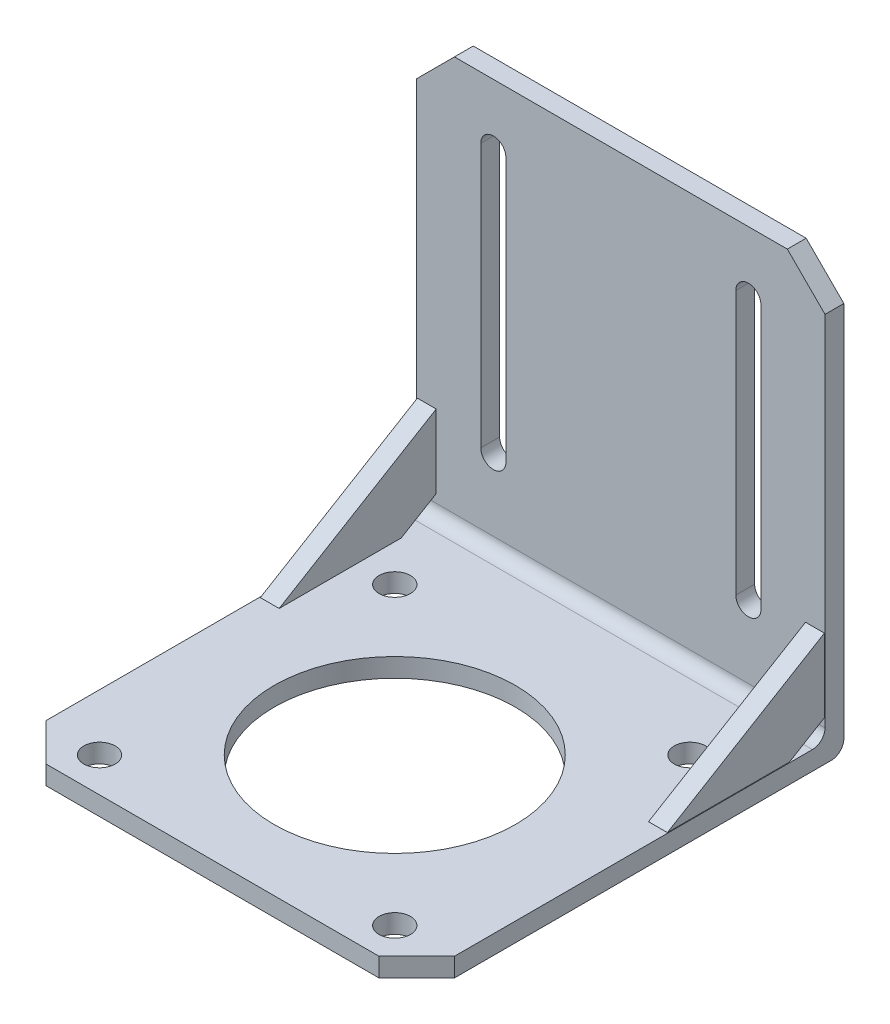
ISO-10303-21;
HEADER;
FILE_DESCRIPTION(('STEP AP214'),'2;1');
FILE_NAME('part.step','',(''),(''),'','','');
FILE_SCHEMA(('AUTOMOTIVE_DESIGN { 1 0 10303 214 1 1 1 1 }'));
ENDSEC;
DATA;
#1=APPLICATION_CONTEXT('core data for automotive mechanical design processes');
#2=APPLICATION_PROTOCOL_DEFINITION('international standard','automotive_design',2000,#1);
#3=PRODUCT_CONTEXT('',#1,'mechanical');
#4=PRODUCT('Part','Part','',(#3));
#5=PRODUCT_RELATED_PRODUCT_CATEGORY('part','',(#4));
#6=PRODUCT_DEFINITION_FORMATION('','',#4);
#7=PRODUCT_DEFINITION_CONTEXT('part definition',#1,'design');
#8=PRODUCT_DEFINITION('design','',#6,#7);
#9=PRODUCT_DEFINITION_SHAPE('','',#8);
#10=(LENGTH_UNIT() NAMED_UNIT(*) SI_UNIT(.MILLI.,.METRE.));
#11=(NAMED_UNIT(*) PLANE_ANGLE_UNIT() SI_UNIT($,.RADIAN.));
#12=(NAMED_UNIT(*) SI_UNIT($,.STERADIAN.) SOLID_ANGLE_UNIT());
#13=UNCERTAINTY_MEASURE_WITH_UNIT(LENGTH_MEASURE(1.E-05),#10,'distance_accuracy_value','');
#14=(GEOMETRIC_REPRESENTATION_CONTEXT(3) GLOBAL_UNCERTAINTY_ASSIGNED_CONTEXT((#13)) GLOBAL_UNIT_ASSIGNED_CONTEXT((#10,
#11,#12)) REPRESENTATION_CONTEXT('',''));
#15=CARTESIAN_POINT('',(0.,0.,0.));
#16=DIRECTION('',(0.,0.,1.));
#17=DIRECTION('',(1.,0.,0.));
#18=AXIS2_PLACEMENT_3D('',#15,#16,#17);
#19=CARTESIAN_POINT('',(-32.5,3.,0.));
#20=DIRECTION('',(1.,0.,0.));
#21=DIRECTION('',(0.,0.,-1.));
#22=AXIS2_PLACEMENT_3D('',#19,#20,#21);
#23=PLANE('',#22);
#24=DIRECTION('',(0.,-1.,0.));
#25=VECTOR('',#24,1.);
#26=CARTESIAN_POINT('',(-32.5,68.,-65.));
#27=LINE('',#26,#25);
#28=CARTESIAN_POINT('',(-32.5,62.,-65.));
#29=VERTEX_POINT('',#28);
#30=CARTESIAN_POINT('',(-32.5,5.,-65.));
#31=VERTEX_POINT('',#30);
#32=EDGE_CURVE('E455',#29,#31,#27,.T.);
#33=ORIENTED_EDGE('',*,*,#32,.F.);
#34=DIRECTION('',(0.,0.,-1.));
#35=VECTOR('',#34,1.);
#36=CARTESIAN_POINT('',(-32.5,62.,0.));
#37=LINE('',#36,#35);
#38=CARTESIAN_POINT('',(-32.5,62.,-68.));
#39=VERTEX_POINT('',#38);
#40=EDGE_CURVE('E519',#29,#39,#37,.T.);
#41=ORIENTED_EDGE('',*,*,#40,.T.);
#42=DIRECTION('',(0.,-1.,0.));
#43=VECTOR('',#42,1.);
#44=CARTESIAN_POINT('',(-32.5,68.,-68.));
#45=LINE('',#44,#43);
#46=CARTESIAN_POINT('',(-32.5,2.,-68.));
#47=VERTEX_POINT('',#46);
#48=EDGE_CURVE('E454',#39,#47,#45,.T.);
#49=ORIENTED_EDGE('',*,*,#48,.T.);
#50=CARTESIAN_POINT('',(-32.5,2.,-66.));
#51=DIRECTION('',(1.,0.,0.));
#52=DIRECTION('',(0.,0.,-1.));
#53=AXIS2_PLACEMENT_3D('',#50,#51,#52);
#54=CIRCLE('',#53,2.);
#55=CARTESIAN_POINT('',(-32.5,0.,-66.));
#56=VERTEX_POINT('',#55);
#57=EDGE_CURVE('E497',#47,#56,#54,.F.);
#58=ORIENTED_EDGE('',*,*,#57,.T.);
#59=DIRECTION('',(0.,0.,1.));
#60=VECTOR('',#59,1.);
#61=CARTESIAN_POINT('',(-32.5,0.,0.));
#62=LINE('',#61,#60);
#63=CARTESIAN_POINT('',(-32.5,0.,-6.00000000000001));
#64=VERTEX_POINT('',#63);
#65=EDGE_CURVE('E458',#56,#64,#62,.T.);
#66=ORIENTED_EDGE('',*,*,#65,.T.);
#67=DIRECTION('',(0.,1.,0.));
#68=VECTOR('',#67,1.);
#69=CARTESIAN_POINT('',(-32.5,3.,-6.00000000000001));
#70=LINE('',#69,#68);
#71=CARTESIAN_POINT('',(-32.5,3.,-6.00000000000001));
#72=VERTEX_POINT('',#71);
#73=EDGE_CURVE('E516',#64,#72,#70,.T.);
#74=ORIENTED_EDGE('',*,*,#73,.T.);
#75=DIRECTION('',(0.,0.,1.));
#76=VECTOR('',#75,1.);
#77=CARTESIAN_POINT('',(-32.5,3.,0.));
#78=LINE('',#77,#76);
#79=CARTESIAN_POINT('',(-32.5,3.,-63.));
#80=VERTEX_POINT('',#79);
#81=EDGE_CURVE('E467',#80,#72,#78,.T.);
#82=ORIENTED_EDGE('',*,*,#81,.F.);
#83=CARTESIAN_POINT('',(-32.5,5.,-63.));
#84=DIRECTION('',(1.,0.,0.));
#85=DIRECTION('',(0.,0.,-1.));
#86=AXIS2_PLACEMENT_3D('',#83,#84,#85);
#87=CIRCLE('',#86,2.);
#88=EDGE_CURVE('E508',#80,#31,#87,.T.);
#89=ORIENTED_EDGE('',*,*,#88,.T.);
#90=EDGE_LOOP('',(#33,#41,#49,#58,#66,#74,#82,#89));
#91=FACE_BOUND('',#90,.T.);
#92=ADVANCED_FACE('F45',(#91),#23,.F.);
#93=CARTESIAN_POINT('',(-32.5,3.,0.));
#94=DIRECTION('',(0.,0.,-1.));
#95=DIRECTION('',(-1.,0.,0.));
#96=AXIS2_PLACEMENT_3D('',#93,#94,#95);
#97=PLANE('',#96);
#98=DIRECTION('',(1.,0.,0.));
#99=VECTOR('',#98,1.);
#100=CARTESIAN_POINT('',(-32.5,0.,0.));
#101=LINE('',#100,#99);
#102=CARTESIAN_POINT('',(-26.5,0.,0.));
#103=VERTEX_POINT('',#102);
#104=CARTESIAN_POINT('',(26.5,0.,0.));
#105=VERTEX_POINT('',#104);
#106=EDGE_CURVE('E481',#103,#105,#101,.T.);
#107=ORIENTED_EDGE('',*,*,#106,.T.);
#108=DIRECTION('',(0.,1.,0.));
#109=VECTOR('',#108,1.);
#110=CARTESIAN_POINT('',(26.5,3.,0.));
#111=LINE('',#110,#109);
#112=CARTESIAN_POINT('',(26.5,3.,0.));
#113=VERTEX_POINT('',#112);
#114=EDGE_CURVE('E61',#105,#113,#111,.T.);
#115=ORIENTED_EDGE('',*,*,#114,.T.);
#116=DIRECTION('',(1.,0.,0.));
#117=VECTOR('',#116,1.);
#118=CARTESIAN_POINT('',(-32.5,3.,0.));
#119=LINE('',#118,#117);
#120=CARTESIAN_POINT('',(-26.5,3.,0.));
#121=VERTEX_POINT('',#120);
#122=EDGE_CURVE('E470',#121,#113,#119,.T.);
#123=ORIENTED_EDGE('',*,*,#122,.F.);
#124=DIRECTION('',(0.,-1.,0.));
#125=VECTOR('',#124,1.);
#126=CARTESIAN_POINT('',(-26.5,3.,0.));
#127=LINE('',#126,#125);
#128=EDGE_CURVE('E554',#121,#103,#127,.T.);
#129=ORIENTED_EDGE('',*,*,#128,.T.);
#130=EDGE_LOOP('',(#107,#115,#123,#129));
#131=FACE_BOUND('',#130,.T.);
#132=ADVANCED_FACE('F707',(#131),#97,.F.);
#133=CARTESIAN_POINT('',(32.5,3.,0.));
#134=DIRECTION('',(-1.,0.,0.));
#135=DIRECTION('',(0.,0.,1.));
#136=AXIS2_PLACEMENT_3D('',#133,#134,#135);
#137=PLANE('',#136);
#138=DIRECTION('',(0.,-1.,0.));
#139=VECTOR('',#138,1.);
#140=CARTESIAN_POINT('',(32.5,68.,-68.));
#141=LINE('',#140,#139);
#142=CARTESIAN_POINT('',(32.5,62.,-68.));
#143=VERTEX_POINT('',#142);
#144=CARTESIAN_POINT('',(32.5,2.,-68.));
#145=VERTEX_POINT('',#144);
#146=EDGE_CURVE('E462',#143,#145,#141,.T.);
#147=ORIENTED_EDGE('',*,*,#146,.F.);
#148=DIRECTION('',(0.,0.,1.));
#149=VECTOR('',#148,1.);
#150=CARTESIAN_POINT('',(32.5,62.,0.));
#151=LINE('',#150,#149);
#152=CARTESIAN_POINT('',(32.5,62.,-65.));
#153=VERTEX_POINT('',#152);
#154=EDGE_CURVE('E544',#143,#153,#151,.T.);
#155=ORIENTED_EDGE('',*,*,#154,.T.);
#156=DIRECTION('',(0.,-1.,0.));
#157=VECTOR('',#156,1.);
#158=CARTESIAN_POINT('',(32.5,68.,-65.));
#159=LINE('',#158,#157);
#160=CARTESIAN_POINT('',(32.5,5.,-65.));
#161=VERTEX_POINT('',#160);
#162=EDGE_CURVE('E459',#153,#161,#159,.T.);
#163=ORIENTED_EDGE('',*,*,#162,.T.);
#164=CARTESIAN_POINT('',(32.5,5.,-63.));
#165=DIRECTION('',(-1.,0.,0.));
#166=DIRECTION('',(0.,0.,1.));
#167=AXIS2_PLACEMENT_3D('',#164,#165,#166);
#168=CIRCLE('',#167,2.);
#169=CARTESIAN_POINT('',(32.5,3.,-63.));
#170=VERTEX_POINT('',#169);
#171=EDGE_CURVE('E512',#161,#170,#168,.T.);
#172=ORIENTED_EDGE('',*,*,#171,.T.);
#173=DIRECTION('',(0.,0.,-1.));
#174=VECTOR('',#173,1.);
#175=CARTESIAN_POINT('',(32.5,3.,0.));
#176=LINE('',#175,#174);
#177=CARTESIAN_POINT('',(32.5,3.,-5.99999999999999));
#178=VERTEX_POINT('',#177);
#179=EDGE_CURVE('E474',#178,#170,#176,.T.);
#180=ORIENTED_EDGE('',*,*,#179,.F.);
#181=DIRECTION('',(0.,-1.,0.));
#182=VECTOR('',#181,1.);
#183=CARTESIAN_POINT('',(32.5,3.,-5.99999999999999));
#184=LINE('',#183,#182);
#185=CARTESIAN_POINT('',(32.5,0.,-5.99999999999999));
#186=VERTEX_POINT('',#185);
#187=EDGE_CURVE('E540',#178,#186,#184,.T.);
#188=ORIENTED_EDGE('',*,*,#187,.T.);
#189=DIRECTION('',(0.,0.,-1.));
#190=VECTOR('',#189,1.);
#191=CARTESIAN_POINT('',(32.5,0.,0.));
#192=LINE('',#191,#190);
#193=CARTESIAN_POINT('',(32.5,0.,-66.));
#194=VERTEX_POINT('',#193);
#195=EDGE_CURVE('E471',#186,#194,#192,.T.);
#196=ORIENTED_EDGE('',*,*,#195,.T.);
#197=CARTESIAN_POINT('',(32.5,2.,-66.));
#198=DIRECTION('',(-1.,0.,0.));
#199=DIRECTION('',(0.,0.,1.));
#200=AXIS2_PLACEMENT_3D('',#197,#198,#199);
#201=CIRCLE('',#200,2.);
#202=EDGE_CURVE('E489',#194,#145,#201,.F.);
#203=ORIENTED_EDGE('',*,*,#202,.T.);
#204=EDGE_LOOP('',(#147,#155,#163,#172,#180,#188,#196,#203));
#205=FACE_BOUND('',#204,.T.);
#206=ADVANCED_FACE('F612',(#205),#137,.F.);
#207=CARTESIAN_POINT('',(0.,3.,0.));
#208=DIRECTION('',(0.,-1.,0.));
#209=DIRECTION('',(0.,0.,-1.));
#210=AXIS2_PLACEMENT_3D('',#207,#208,#209);
#211=PLANE('',#210);
#212=DIRECTION('',(1.,0.,0.));
#213=VECTOR('',#212,1.);
#214=CARTESIAN_POINT('',(29.4,3.,-40.));
#215=LINE('',#214,#213);
#216=CARTESIAN_POINT('',(29.4,3.,-40.));
#217=VERTEX_POINT('',#216);
#218=CARTESIAN_POINT('',(32.4,3.,-40.));
#219=VERTEX_POINT('',#218);
#220=EDGE_CURVE('E254',#217,#219,#215,.T.);
#221=ORIENTED_EDGE('',*,*,#220,.F.);
#222=DIRECTION('',(0.,0.,-1.));
#223=VECTOR('',#222,1.);
#224=CARTESIAN_POINT('',(29.4,3.,-40.));
#225=LINE('',#224,#223);
#226=CARTESIAN_POINT('',(29.4,3.,-59.436506316151));
#227=VERTEX_POINT('',#226);
#228=EDGE_CURVE('E244',#217,#227,#225,.T.);
#229=ORIENTED_EDGE('',*,*,#228,.T.);
#230=DIRECTION('',(1.,0.,0.));
#231=VECTOR('',#230,1.);
#232=CARTESIAN_POINT('',(29.4,3.,-59.436506316151));
#233=LINE('',#232,#231);
#234=CARTESIAN_POINT('',(32.4,3.,-59.436506316151));
#235=VERTEX_POINT('',#234);
#236=EDGE_CURVE('E239',#227,#235,#233,.T.);
#237=ORIENTED_EDGE('',*,*,#236,.T.);
#238=DIRECTION('',(0.,0.,-1.));
#239=VECTOR('',#238,1.);
#240=CARTESIAN_POINT('',(32.4,3.,-40.));
#241=LINE('',#240,#239);
#242=EDGE_CURVE('E571',#219,#235,#241,.T.);
#243=ORIENTED_EDGE('',*,*,#242,.F.);
#244=EDGE_LOOP('',(#221,#229,#237,#243));
#245=FACE_BOUND('',#244,.T.);
#246=DIRECTION('',(-1.,0.,0.));
#247=VECTOR('',#246,1.);
#248=CARTESIAN_POINT('',(-29.4,3.,-59.436506316151));
#249=LINE('',#248,#247);
#250=CARTESIAN_POINT('',(-29.4,3.,-59.436506316151));
#251=VERTEX_POINT('',#250);
#252=CARTESIAN_POINT('',(-32.4,3.,-59.436506316151));
#253=VERTEX_POINT('',#252);
#254=EDGE_CURVE('E304',#251,#253,#249,.T.);
#255=ORIENTED_EDGE('',*,*,#254,.F.);
#256=DIRECTION('',(0.,0.,1.));
#257=VECTOR('',#256,1.);
#258=CARTESIAN_POINT('',(-29.4,3.,-59.436506316151));
#259=LINE('',#258,#257);
#260=CARTESIAN_POINT('',(-29.4,3.,-40.));
#261=VERTEX_POINT('',#260);
#262=EDGE_CURVE('E275',#251,#261,#259,.T.);
#263=ORIENTED_EDGE('',*,*,#262,.T.);
#264=DIRECTION('',(-1.,0.,0.));
#265=VECTOR('',#264,1.);
#266=CARTESIAN_POINT('',(-29.4,3.,-40.));
#267=LINE('',#266,#265);
#268=CARTESIAN_POINT('',(-32.4,3.,-40.));
#269=VERTEX_POINT('',#268);
#270=EDGE_CURVE('E291',#261,#269,#267,.T.);
#271=ORIENTED_EDGE('',*,*,#270,.T.);
#272=DIRECTION('',(0.,0.,1.));
#273=VECTOR('',#272,1.);
#274=CARTESIAN_POINT('',(-32.4,3.,-59.436506316151));
#275=LINE('',#274,#273);
#276=EDGE_CURVE('E266',#253,#269,#275,.T.);
#277=ORIENTED_EDGE('',*,*,#276,.F.);
#278=EDGE_LOOP('',(#255,#263,#271,#277));
#279=FACE_BOUND('',#278,.T.);
#280=CARTESIAN_POINT('',(23.5,3.,-52.5000000000007));
#281=DIRECTION('',(0.,1.,0.));
#282=DIRECTION('',(0.,0.,1.));
#283=AXIS2_PLACEMENT_3D('',#280,#281,#282);
#284=CIRCLE('',#283,2.5);
#285=CARTESIAN_POINT('',(23.5,3.,-50.0000000000007));
#286=VERTEX_POINT('',#285);
#287=EDGE_CURVE('E412',#286,#286,#284,.T.);
#288=ORIENTED_EDGE('',*,*,#287,.F.);
#289=EDGE_LOOP('',(#288));
#290=FACE_BOUND('',#289,.T.);
#291=CARTESIAN_POINT('',(23.5000000000007,3.,-5.50000000000066));
#292=DIRECTION('',(0.,1.,0.));
#293=DIRECTION('',(0.,0.,1.));
#294=AXIS2_PLACEMENT_3D('',#291,#292,#293);
#295=CIRCLE('',#294,2.49999999999999);
#296=CARTESIAN_POINT('',(23.5000000000007,3.,-3.00000000000067));
#297=VERTEX_POINT('',#296);
#298=EDGE_CURVE('E420',#297,#297,#295,.T.);
#299=ORIENTED_EDGE('',*,*,#298,.F.);
#300=EDGE_LOOP('',(#299));
#301=FACE_BOUND('',#300,.T.);
#302=CARTESIAN_POINT('',(-23.4999999999993,3.,-5.5));
#303=DIRECTION('',(0.,1.,0.));
#304=DIRECTION('',(0.,0.,1.));
#305=AXIS2_PLACEMENT_3D('',#302,#303,#304);
#306=CIRCLE('',#305,2.5);
#307=CARTESIAN_POINT('',(-23.4999999999993,3.,-3.));
#308=VERTEX_POINT('',#307);
#309=EDGE_CURVE('E397',#308,#308,#306,.T.);
#310=ORIENTED_EDGE('',*,*,#309,.F.);
#311=EDGE_LOOP('',(#310));
#312=FACE_BOUND('',#311,.T.);
#313=CARTESIAN_POINT('',(-23.5,3.,-52.5));
#314=DIRECTION('',(0.,1.,0.));
#315=DIRECTION('',(0.,0.,1.));
#316=AXIS2_PLACEMENT_3D('',#313,#314,#315);
#317=CIRCLE('',#316,2.5);
#318=CARTESIAN_POINT('',(-23.5,3.,-50.));
#319=VERTEX_POINT('',#318);
#320=EDGE_CURVE('E411',#319,#319,#317,.T.);
#321=ORIENTED_EDGE('',*,*,#320,.F.);
#322=EDGE_LOOP('',(#321));
#323=FACE_BOUND('',#322,.T.);
#324=CARTESIAN_POINT('',(0.,3.,-29.));
#325=DIRECTION('',(0.,1.,0.));
#326=DIRECTION('',(0.,0.,1.));
#327=AXIS2_PLACEMENT_3D('',#324,#325,#326);
#328=CIRCLE('',#327,19.2);
#329=CARTESIAN_POINT('',(0.,3.,-9.8));
#330=VERTEX_POINT('',#329);
#331=EDGE_CURVE('E435',#330,#330,#328,.T.);
#332=ORIENTED_EDGE('',*,*,#331,.F.);
#333=EDGE_LOOP('',(#332));
#334=FACE_BOUND('',#333,.T.);
#335=ORIENTED_EDGE('',*,*,#122,.T.);
#336=DIRECTION('',(-0.707106781186549,0.,0.707106781186546));
#337=VECTOR('',#336,1.);
#338=CARTESIAN_POINT('',(32.5,3.,-5.99999999999999));
#339=LINE('',#338,#337);
#340=EDGE_CURVE('E11',#113,#178,#339,.F.);
#341=ORIENTED_EDGE('',*,*,#340,.T.);
#342=ORIENTED_EDGE('',*,*,#179,.T.);
#343=DIRECTION('',(-1.,0.,0.));
#344=VECTOR('',#343,1.);
#345=CARTESIAN_POINT('',(0.,3.,-63.));
#346=LINE('',#345,#344);
#347=EDGE_CURVE('E500',#170,#80,#346,.T.);
#348=ORIENTED_EDGE('',*,*,#347,.T.);
#349=ORIENTED_EDGE('',*,*,#81,.T.);
#350=DIRECTION('',(-0.707106781186547,0.,-0.707106781186548));
#351=VECTOR('',#350,1.);
#352=CARTESIAN_POINT('',(-26.5,3.,0.));
#353=LINE('',#352,#351);
#354=EDGE_CURVE('E54',#72,#121,#353,.F.);
#355=ORIENTED_EDGE('',*,*,#354,.T.);
#356=EDGE_LOOP('',(#335,#341,#342,#348,#349,#355));
#357=FACE_BOUND('',#356,.T.);
#358=ADVANCED_FACE('F608',(#245,#279,#290,#301,#312,#323,#334,#357),#211,.F.);
#359=CARTESIAN_POINT('',(0.,0.,0.));
#360=DIRECTION('',(0.,-1.,0.));
#361=DIRECTION('',(0.,0.,-1.));
#362=AXIS2_PLACEMENT_3D('',#359,#360,#361);
#363=PLANE('',#362);
#364=CARTESIAN_POINT('',(23.5,0.,-52.5000000000007));
#365=DIRECTION('',(0.,1.,0.));
#366=DIRECTION('',(0.,0.,1.));
#367=AXIS2_PLACEMENT_3D('',#364,#365,#366);
#368=CIRCLE('',#367,2.5);
#369=CARTESIAN_POINT('',(23.5,0.,-50.0000000000007));
#370=VERTEX_POINT('',#369);
#371=EDGE_CURVE('E407',#370,#370,#368,.T.);
#372=ORIENTED_EDGE('',*,*,#371,.T.);
#373=EDGE_LOOP('',(#372));
#374=FACE_BOUND('',#373,.T.);
#375=CARTESIAN_POINT('',(23.5000000000007,0.,-5.50000000000066));
#376=DIRECTION('',(0.,1.,0.));
#377=DIRECTION('',(0.,0.,1.));
#378=AXIS2_PLACEMENT_3D('',#375,#376,#377);
#379=CIRCLE('',#378,2.49999999999999);
#380=CARTESIAN_POINT('',(23.5000000000007,0.,-3.00000000000067));
#381=VERTEX_POINT('',#380);
#382=EDGE_CURVE('E416',#381,#381,#379,.T.);
#383=ORIENTED_EDGE('',*,*,#382,.T.);
#384=EDGE_LOOP('',(#383));
#385=FACE_BOUND('',#384,.T.);
#386=CARTESIAN_POINT('',(-23.4999999999993,0.,-5.5));
#387=DIRECTION('',(0.,1.,0.));
#388=DIRECTION('',(0.,0.,1.));
#389=AXIS2_PLACEMENT_3D('',#386,#387,#388);
#390=CIRCLE('',#389,2.5);
#391=CARTESIAN_POINT('',(-23.4999999999993,0.,-3.));
#392=VERTEX_POINT('',#391);
#393=EDGE_CURVE('E424',#392,#392,#390,.T.);
#394=ORIENTED_EDGE('',*,*,#393,.T.);
#395=EDGE_LOOP('',(#394));
#396=FACE_BOUND('',#395,.T.);
#397=CARTESIAN_POINT('',(-23.5,0.,-52.5));
#398=DIRECTION('',(0.,1.,0.));
#399=DIRECTION('',(0.,0.,1.));
#400=AXIS2_PLACEMENT_3D('',#397,#398,#399);
#401=CIRCLE('',#400,2.5);
#402=CARTESIAN_POINT('',(-23.5,0.,-50.));
#403=VERTEX_POINT('',#402);
#404=EDGE_CURVE('E431',#403,#403,#401,.T.);
#405=ORIENTED_EDGE('',*,*,#404,.T.);
#406=EDGE_LOOP('',(#405));
#407=FACE_BOUND('',#406,.T.);
#408=CARTESIAN_POINT('',(0.,0.,-29.));
#409=DIRECTION('',(0.,1.,0.));
#410=DIRECTION('',(0.,0.,1.));
#411=AXIS2_PLACEMENT_3D('',#408,#409,#410);
#412=CIRCLE('',#411,19.2);
#413=CARTESIAN_POINT('',(0.,0.,-9.8));
#414=VERTEX_POINT('',#413);
#415=EDGE_CURVE('E439',#414,#414,#412,.T.);
#416=ORIENTED_EDGE('',*,*,#415,.T.);
#417=EDGE_LOOP('',(#416));
#418=FACE_BOUND('',#417,.T.);
#419=ORIENTED_EDGE('',*,*,#195,.F.);
#420=DIRECTION('',(0.707106781186549,0.,-0.707106781186546));
#421=VECTOR('',#420,1.);
#422=CARTESIAN_POINT('',(13.2499999999999,0.,13.25));
#423=LINE('',#422,#421);
#424=EDGE_CURVE('E551',#186,#105,#423,.F.);
#425=ORIENTED_EDGE('',*,*,#424,.T.);
#426=ORIENTED_EDGE('',*,*,#106,.F.);
#427=DIRECTION('',(0.707106781186547,0.,0.707106781186548));
#428=VECTOR('',#427,1.);
#429=CARTESIAN_POINT('',(-13.25,0.,13.25));
#430=LINE('',#429,#428);
#431=EDGE_CURVE('E548',#103,#64,#430,.F.);
#432=ORIENTED_EDGE('',*,*,#431,.T.);
#433=ORIENTED_EDGE('',*,*,#65,.F.);
#434=DIRECTION('',(1.,0.,0.));
#435=VECTOR('',#434,1.);
#436=CARTESIAN_POINT('',(0.,0.,-66.));
#437=LINE('',#436,#435);
#438=EDGE_CURVE('E477',#56,#194,#437,.T.);
#439=ORIENTED_EDGE('',*,*,#438,.T.);
#440=EDGE_LOOP('',(#419,#425,#426,#432,#433,#439));
#441=FACE_BOUND('',#440,.T.);
#442=ADVANCED_FACE('F611',(#374,#385,#396,#407,#418,#441),#363,.T.);
#443=CARTESIAN_POINT('',(-32.5,68.,-65.));
#444=DIRECTION('',(0.,0.,1.));
#445=DIRECTION('',(1.,0.,0.));
#446=AXIS2_PLACEMENT_3D('',#443,#444,#445);
#447=PLANE('',#446);
#448=DIRECTION('',(0.,1.,0.));
#449=VECTOR('',#448,1.);
#450=CARTESIAN_POINT('',(29.4,6.3380962103094,-65.));
#451=LINE('',#450,#449);
#452=CARTESIAN_POINT('',(29.4,6.3380962103094,-65.));
#453=VERTEX_POINT('',#452);
#454=CARTESIAN_POINT('',(29.4,18.,-65.));
#455=VERTEX_POINT('',#454);
#456=EDGE_CURVE('E243',#453,#455,#451,.T.);
#457=ORIENTED_EDGE('',*,*,#456,.T.);
#458=DIRECTION('',(1.,0.,0.));
#459=VECTOR('',#458,1.);
#460=CARTESIAN_POINT('',(29.4,18.,-65.));
#461=LINE('',#460,#459);
#462=CARTESIAN_POINT('',(32.4,18.,-65.));
#463=VERTEX_POINT('',#462);
#464=EDGE_CURVE('E261',#455,#463,#461,.T.);
#465=ORIENTED_EDGE('',*,*,#464,.T.);
#466=DIRECTION('',(0.,1.,0.));
#467=VECTOR('',#466,1.);
#468=CARTESIAN_POINT('',(32.4,6.3380962103094,-65.));
#469=LINE('',#468,#467);
#470=CARTESIAN_POINT('',(32.4,6.33809621030941,-65.));
#471=VERTEX_POINT('',#470);
#472=EDGE_CURVE('E259',#471,#463,#469,.T.);
#473=ORIENTED_EDGE('',*,*,#472,.F.);
#474=DIRECTION('',(1.,0.,0.));
#475=VECTOR('',#474,1.);
#476=CARTESIAN_POINT('',(29.4,6.3380962103094,-65.));
#477=LINE('',#476,#475);
#478=EDGE_CURVE('E237',#453,#471,#477,.T.);
#479=ORIENTED_EDGE('',*,*,#478,.F.);
#480=EDGE_LOOP('',(#457,#465,#473,#479));
#481=FACE_BOUND('',#480,.T.);
#482=DIRECTION('',(0.,-1.,0.));
#483=VECTOR('',#482,1.);
#484=CARTESIAN_POINT('',(-29.4,18.,-65.));
#485=LINE('',#484,#483);
#486=CARTESIAN_POINT('',(-29.4,18.,-65.));
#487=VERTEX_POINT('',#486);
#488=CARTESIAN_POINT('',(-29.4,6.3380962103094,-65.));
#489=VERTEX_POINT('',#488);
#490=EDGE_CURVE('E283',#487,#489,#485,.T.);
#491=ORIENTED_EDGE('',*,*,#490,.T.);
#492=DIRECTION('',(-1.,0.,0.));
#493=VECTOR('',#492,1.);
#494=CARTESIAN_POINT('',(-29.4,6.3380962103094,-65.));
#495=LINE('',#494,#493);
#496=CARTESIAN_POINT('',(-32.4,6.3380962103094,-65.));
#497=VERTEX_POINT('',#496);
#498=EDGE_CURVE('E309',#489,#497,#495,.T.);
#499=ORIENTED_EDGE('',*,*,#498,.T.);
#500=DIRECTION('',(0.,-1.,0.));
#501=VECTOR('',#500,1.);
#502=CARTESIAN_POINT('',(-32.4,18.,-65.));
#503=LINE('',#502,#501);
#504=CARTESIAN_POINT('',(-32.4,18.,-65.));
#505=VERTEX_POINT('',#504);
#506=EDGE_CURVE('E298',#505,#497,#503,.T.);
#507=ORIENTED_EDGE('',*,*,#506,.F.);
#508=DIRECTION('',(-1.,0.,0.));
#509=VECTOR('',#508,1.);
#510=CARTESIAN_POINT('',(-29.4,18.,-65.));
#511=LINE('',#510,#509);
#512=EDGE_CURVE('E313',#487,#505,#511,.T.);
#513=ORIENTED_EDGE('',*,*,#512,.F.);
#514=EDGE_LOOP('',(#491,#499,#507,#513));
#515=FACE_BOUND('',#514,.T.);
#516=CARTESIAN_POINT('',(20.3,58.2,-65.));
#517=DIRECTION('',(0.,0.,1.));
#518=DIRECTION('',(-1.,0.,0.));
#519=AXIS2_PLACEMENT_3D('',#516,#517,#518);
#520=CIRCLE('',#519,2.00000000000001);
#521=CARTESIAN_POINT('',(22.3,58.2,-65.));
#522=VERTEX_POINT('',#521);
#523=CARTESIAN_POINT('',(18.3,58.2,-65.));
#524=VERTEX_POINT('',#523);
#525=EDGE_CURVE('E308',#522,#524,#520,.T.);
#526=ORIENTED_EDGE('',*,*,#525,.F.);
#527=DIRECTION('',(0.,1.,0.));
#528=VECTOR('',#527,1.);
#529=CARTESIAN_POINT('',(22.3,58.2,-65.));
#530=LINE('',#529,#528);
#531=CARTESIAN_POINT('',(22.3,16.2,-65.));
#532=VERTEX_POINT('',#531);
#533=EDGE_CURVE('E324',#532,#522,#530,.T.);
#534=ORIENTED_EDGE('',*,*,#533,.F.);
#535=CARTESIAN_POINT('',(20.3,16.2,-65.));
#536=DIRECTION('',(0.,0.,1.));
#537=DIRECTION('',(-1.,0.,0.));
#538=AXIS2_PLACEMENT_3D('',#535,#536,#537);
#539=CIRCLE('',#538,2.00000000000001);
#540=CARTESIAN_POINT('',(18.3,16.2,-65.));
#541=VERTEX_POINT('',#540);
#542=EDGE_CURVE('E343',#541,#532,#539,.T.);
#543=ORIENTED_EDGE('',*,*,#542,.F.);
#544=DIRECTION('',(0.,-1.,0.));
#545=VECTOR('',#544,1.);
#546=CARTESIAN_POINT('',(18.3,58.2,-65.));
#547=LINE('',#546,#545);
#548=EDGE_CURVE('E339',#524,#541,#547,.T.);
#549=ORIENTED_EDGE('',*,*,#548,.F.);
#550=EDGE_LOOP('',(#526,#534,#543,#549));
#551=FACE_BOUND('',#550,.T.);
#552=CARTESIAN_POINT('',(-20.3,58.2,-65.));
#553=DIRECTION('',(0.,0.,1.));
#554=DIRECTION('',(1.,0.,0.));
#555=AXIS2_PLACEMENT_3D('',#552,#553,#554);
#556=CIRCLE('',#555,2.00000000000001);
#557=CARTESIAN_POINT('',(-18.3,58.2,-65.));
#558=VERTEX_POINT('',#557);
#559=CARTESIAN_POINT('',(-22.3,58.2,-65.));
#560=VERTEX_POINT('',#559);
#561=EDGE_CURVE('E353',#558,#560,#556,.T.);
#562=ORIENTED_EDGE('',*,*,#561,.F.);
#563=DIRECTION('',(0.,1.,0.));
#564=VECTOR('',#563,1.);
#565=CARTESIAN_POINT('',(-18.3,58.2,-65.));
#566=LINE('',#565,#564);
#567=CARTESIAN_POINT('',(-18.3,16.2,-65.));
#568=VERTEX_POINT('',#567);
#569=EDGE_CURVE('E368',#568,#558,#566,.T.);
#570=ORIENTED_EDGE('',*,*,#569,.F.);
#571=CARTESIAN_POINT('',(-20.3,16.2,-65.));
#572=DIRECTION('',(0.,0.,1.));
#573=DIRECTION('',(1.,0.,0.));
#574=AXIS2_PLACEMENT_3D('',#571,#572,#573);
#575=CIRCLE('',#574,2.00000000000001);
#576=CARTESIAN_POINT('',(-22.3,16.2,-65.));
#577=VERTEX_POINT('',#576);
#578=EDGE_CURVE('E387',#577,#568,#575,.T.);
#579=ORIENTED_EDGE('',*,*,#578,.F.);
#580=DIRECTION('',(0.,-1.,0.));
#581=VECTOR('',#580,1.);
#582=CARTESIAN_POINT('',(-22.3,58.2,-65.));
#583=LINE('',#582,#581);
#584=EDGE_CURVE('E383',#560,#577,#583,.T.);
#585=ORIENTED_EDGE('',*,*,#584,.F.);
#586=EDGE_LOOP('',(#562,#570,#579,#585));
#587=FACE_BOUND('',#586,.T.);
#588=DIRECTION('',(-1.,0.,0.));
#589=VECTOR('',#588,1.);
#590=CARTESIAN_POINT('',(-32.5,68.,-65.));
#591=LINE('',#590,#589);
#592=CARTESIAN_POINT('',(26.5,68.,-65.));
#593=VERTEX_POINT('',#592);
#594=CARTESIAN_POINT('',(-26.5,68.,-65.));
#595=VERTEX_POINT('',#594);
#596=EDGE_CURVE('E450',#593,#595,#591,.T.);
#597=ORIENTED_EDGE('',*,*,#596,.T.);
#598=DIRECTION('',(0.70710678118655,0.707106781186545,0.));
#599=VECTOR('',#598,1.);
#600=CARTESIAN_POINT('',(-29.5,65.,-65.));
#601=LINE('',#600,#599);
#602=EDGE_CURVE('E538',#595,#29,#601,.F.);
#603=ORIENTED_EDGE('',*,*,#602,.T.);
#604=ORIENTED_EDGE('',*,*,#32,.T.);
#605=DIRECTION('',(-1.,0.,0.));
#606=VECTOR('',#605,1.);
#607=CARTESIAN_POINT('',(-32.5,5.,-65.));
#608=LINE('',#607,#606);
#609=EDGE_CURVE('E504',#31,#161,#608,.F.);
#610=ORIENTED_EDGE('',*,*,#609,.T.);
#611=ORIENTED_EDGE('',*,*,#162,.F.);
#612=DIRECTION('',(0.70710678118655,-0.707106781186545,0.));
#613=VECTOR('',#612,1.);
#614=CARTESIAN_POINT('',(-3.00000000000021,97.5,-65.));
#615=LINE('',#614,#613);
#616=EDGE_CURVE('E535',#153,#593,#615,.F.);
#617=ORIENTED_EDGE('',*,*,#616,.T.);
#618=EDGE_LOOP('',(#597,#603,#604,#610,#611,#617));
#619=FACE_BOUND('',#618,.T.);
#620=ADVANCED_FACE('F256',(#481,#515,#551,#587,#619),#447,.T.);
#621=CARTESIAN_POINT('',(-32.5,68.,-68.));
#622=DIRECTION('',(0.,0.,-1.));
#623=DIRECTION('',(-1.,0.,0.));
#624=AXIS2_PLACEMENT_3D('',#621,#622,#623);
#625=PLANE('',#624);
#626=CARTESIAN_POINT('',(20.3,58.2,-68.));
#627=DIRECTION('',(0.,0.,1.));
#628=DIRECTION('',(-1.,0.,0.));
#629=AXIS2_PLACEMENT_3D('',#626,#627,#628);
#630=CIRCLE('',#629,2.00000000000001);
#631=CARTESIAN_POINT('',(22.3,58.2,-68.));
#632=VERTEX_POINT('',#631);
#633=CARTESIAN_POINT('',(18.3,58.2,-68.));
#634=VERTEX_POINT('',#633);
#635=EDGE_CURVE('E319',#632,#634,#630,.T.);
#636=ORIENTED_EDGE('',*,*,#635,.T.);
#637=DIRECTION('',(0.,-1.,0.));
#638=VECTOR('',#637,1.);
#639=CARTESIAN_POINT('',(18.3,58.2,-68.));
#640=LINE('',#639,#638);
#641=CARTESIAN_POINT('',(18.3,16.2,-68.));
#642=VERTEX_POINT('',#641);
#643=EDGE_CURVE('E323',#634,#642,#640,.T.);
#644=ORIENTED_EDGE('',*,*,#643,.T.);
#645=CARTESIAN_POINT('',(20.3,16.2,-68.));
#646=DIRECTION('',(0.,0.,1.));
#647=DIRECTION('',(-1.,0.,0.));
#648=AXIS2_PLACEMENT_3D('',#645,#646,#647);
#649=CIRCLE('',#648,2.00000000000001);
#650=CARTESIAN_POINT('',(22.3,16.2,-68.));
#651=VERTEX_POINT('',#650);
#652=EDGE_CURVE('E328',#642,#651,#649,.T.);
#653=ORIENTED_EDGE('',*,*,#652,.T.);
#654=DIRECTION('',(0.,1.,0.));
#655=VECTOR('',#654,1.);
#656=CARTESIAN_POINT('',(22.3,58.2,-68.));
#657=LINE('',#656,#655);
#658=EDGE_CURVE('E332',#651,#632,#657,.T.);
#659=ORIENTED_EDGE('',*,*,#658,.T.);
#660=EDGE_LOOP('',(#636,#644,#653,#659));
#661=FACE_BOUND('',#660,.T.);
#662=CARTESIAN_POINT('',(-20.3,58.2,-68.));
#663=DIRECTION('',(0.,0.,1.));
#664=DIRECTION('',(1.,0.,0.));
#665=AXIS2_PLACEMENT_3D('',#662,#663,#664);
#666=CIRCLE('',#665,2.00000000000001);
#667=CARTESIAN_POINT('',(-18.3,58.2,-68.));
#668=VERTEX_POINT('',#667);
#669=CARTESIAN_POINT('',(-22.3,58.2,-68.));
#670=VERTEX_POINT('',#669);
#671=EDGE_CURVE('E363',#668,#670,#666,.T.);
#672=ORIENTED_EDGE('',*,*,#671,.T.);
#673=DIRECTION('',(0.,-1.,0.));
#674=VECTOR('',#673,1.);
#675=CARTESIAN_POINT('',(-22.3,58.2,-68.));
#676=LINE('',#675,#674);
#677=CARTESIAN_POINT('',(-22.3,16.2,-68.));
#678=VERTEX_POINT('',#677);
#679=EDGE_CURVE('E367',#670,#678,#676,.T.);
#680=ORIENTED_EDGE('',*,*,#679,.T.);
#681=CARTESIAN_POINT('',(-20.3,16.2,-68.));
#682=DIRECTION('',(0.,0.,1.));
#683=DIRECTION('',(1.,0.,0.));
#684=AXIS2_PLACEMENT_3D('',#681,#682,#683);
#685=CIRCLE('',#684,2.00000000000001);
#686=CARTESIAN_POINT('',(-18.3,16.2,-68.));
#687=VERTEX_POINT('',#686);
#688=EDGE_CURVE('E372',#678,#687,#685,.T.);
#689=ORIENTED_EDGE('',*,*,#688,.T.);
#690=DIRECTION('',(0.,1.,0.));
#691=VECTOR('',#690,1.);
#692=CARTESIAN_POINT('',(-18.3,58.2,-68.));
#693=LINE('',#692,#691);
#694=EDGE_CURVE('E376',#687,#668,#693,.T.);
#695=ORIENTED_EDGE('',*,*,#694,.T.);
#696=EDGE_LOOP('',(#672,#680,#689,#695));
#697=FACE_BOUND('',#696,.T.);
#698=ORIENTED_EDGE('',*,*,#48,.F.);
#699=DIRECTION('',(-0.70710678118655,-0.707106781186545,0.));
#700=VECTOR('',#699,1.);
#701=CARTESIAN_POINT('',(-29.5,65.,-68.));
#702=LINE('',#701,#700);
#703=CARTESIAN_POINT('',(-26.5,68.,-68.));
#704=VERTEX_POINT('',#703);
#705=EDGE_CURVE('E526',#39,#704,#702,.F.);
#706=ORIENTED_EDGE('',*,*,#705,.T.);
#707=DIRECTION('',(1.,0.,0.));
#708=VECTOR('',#707,1.);
#709=CARTESIAN_POINT('',(-32.5,68.,-68.));
#710=LINE('',#709,#708);
#711=CARTESIAN_POINT('',(26.5,68.,-68.));
#712=VERTEX_POINT('',#711);
#713=EDGE_CURVE('E443',#704,#712,#710,.T.);
#714=ORIENTED_EDGE('',*,*,#713,.T.);
#715=DIRECTION('',(-0.70710678118655,0.707106781186545,0.));
#716=VECTOR('',#715,1.);
#717=CARTESIAN_POINT('',(-3.00000000000021,97.5,-68.));
#718=LINE('',#717,#716);
#719=EDGE_CURVE('E523',#712,#143,#718,.F.);
#720=ORIENTED_EDGE('',*,*,#719,.T.);
#721=ORIENTED_EDGE('',*,*,#146,.T.);
#722=DIRECTION('',(1.,0.,0.));
#723=VECTOR('',#722,1.);
#724=CARTESIAN_POINT('',(-32.5,2.,-68.));
#725=LINE('',#724,#723);
#726=EDGE_CURVE('E493',#145,#47,#725,.F.);
#727=ORIENTED_EDGE('',*,*,#726,.T.);
#728=EDGE_LOOP('',(#698,#706,#714,#720,#721,#727));
#729=FACE_BOUND('',#728,.T.);
#730=ADVANCED_FACE('F621',(#661,#697,#729),#625,.T.);
#731=CARTESIAN_POINT('',(0.,68.,0.));
#732=DIRECTION('',(0.,-1.,0.));
#733=DIRECTION('',(0.,0.,-1.));
#734=AXIS2_PLACEMENT_3D('',#731,#732,#733);
#735=PLANE('',#734);
#736=ORIENTED_EDGE('',*,*,#713,.F.);
#737=DIRECTION('',(0.,0.,1.));
#738=VECTOR('',#737,1.);
#739=CARTESIAN_POINT('',(-26.5,68.,0.));
#740=LINE('',#739,#738);
#741=EDGE_CURVE('E532',#704,#595,#740,.T.);
#742=ORIENTED_EDGE('',*,*,#741,.T.);
#743=ORIENTED_EDGE('',*,*,#596,.F.);
#744=DIRECTION('',(0.,0.,-1.));
#745=VECTOR('',#744,1.);
#746=CARTESIAN_POINT('',(26.5,68.,0.));
#747=LINE('',#746,#745);
#748=EDGE_CURVE('E529',#593,#712,#747,.T.);
#749=ORIENTED_EDGE('',*,*,#748,.T.);
#750=EDGE_LOOP('',(#736,#742,#743,#749));
#751=FACE_BOUND('',#750,.T.);
#752=ADVANCED_FACE('F624',(#751),#735,.F.);
#753=CARTESIAN_POINT('',(0.,0.,-29.));
#754=DIRECTION('',(0.,1.,0.));
#755=DIRECTION('',(0.,0.,1.));
#756=AXIS2_PLACEMENT_3D('',#753,#754,#755);
#757=CYLINDRICAL_SURFACE('',#756,19.2);
#758=ORIENTED_EDGE('',*,*,#415,.F.);
#759=EDGE_LOOP('',(#758));
#760=FACE_BOUND('',#759,.T.);
#761=ORIENTED_EDGE('',*,*,#331,.T.);
#762=EDGE_LOOP('',(#761));
#763=FACE_BOUND('',#762,.T.);
#764=ADVANCED_FACE('F605',(#760,#763),#757,.F.);
#765=CARTESIAN_POINT('',(-23.5,0.,-52.5));
#766=DIRECTION('',(0.,1.,0.));
#767=DIRECTION('',(0.,0.,1.));
#768=AXIS2_PLACEMENT_3D('',#765,#766,#767);
#769=CYLINDRICAL_SURFACE('',#768,2.5);
#770=ORIENTED_EDGE('',*,*,#404,.F.);
#771=EDGE_LOOP('',(#770));
#772=FACE_BOUND('',#771,.T.);
#773=ORIENTED_EDGE('',*,*,#320,.T.);
#774=EDGE_LOOP('',(#773));
#775=FACE_BOUND('',#774,.T.);
#776=ADVANCED_FACE('F959',(#772,#775),#769,.F.);
#777=CARTESIAN_POINT('',(-23.4999999999993,0.,-5.5));
#778=DIRECTION('',(0.,1.,0.));
#779=DIRECTION('',(0.,0.,1.));
#780=AXIS2_PLACEMENT_3D('',#777,#778,#779);
#781=CYLINDRICAL_SURFACE('',#780,2.5);
#782=ORIENTED_EDGE('',*,*,#393,.F.);
#783=EDGE_LOOP('',(#782));
#784=FACE_BOUND('',#783,.T.);
#785=ORIENTED_EDGE('',*,*,#309,.T.);
#786=EDGE_LOOP('',(#785));
#787=FACE_BOUND('',#786,.T.);
#788=ADVANCED_FACE('F950',(#784,#787),#781,.F.);
#789=CARTESIAN_POINT('',(23.5000000000007,0.,-5.50000000000066));
#790=DIRECTION('',(0.,1.,0.));
#791=DIRECTION('',(0.,0.,1.));
#792=AXIS2_PLACEMENT_3D('',#789,#790,#791);
#793=CYLINDRICAL_SURFACE('',#792,2.49999999999999);
#794=ORIENTED_EDGE('',*,*,#382,.F.);
#795=EDGE_LOOP('',(#794));
#796=FACE_BOUND('',#795,.T.);
#797=ORIENTED_EDGE('',*,*,#298,.T.);
#798=EDGE_LOOP('',(#797));
#799=FACE_BOUND('',#798,.T.);
#800=ADVANCED_FACE('F941',(#796,#799),#793,.F.);
#801=CARTESIAN_POINT('',(23.5,0.,-52.5000000000007));
#802=DIRECTION('',(0.,1.,0.));
#803=DIRECTION('',(0.,0.,1.));
#804=AXIS2_PLACEMENT_3D('',#801,#802,#803);
#805=CYLINDRICAL_SURFACE('',#804,2.5);
#806=ORIENTED_EDGE('',*,*,#371,.F.);
#807=EDGE_LOOP('',(#806));
#808=FACE_BOUND('',#807,.T.);
#809=ORIENTED_EDGE('',*,*,#287,.T.);
#810=EDGE_LOOP('',(#809));
#811=FACE_BOUND('',#810,.T.);
#812=ADVANCED_FACE('F932',(#808,#811),#805,.F.);
#813=CARTESIAN_POINT('',(-20.3,58.2,-68.));
#814=DIRECTION('',(0.,0.,1.));
#815=DIRECTION('',(1.,0.,0.));
#816=AXIS2_PLACEMENT_3D('',#813,#814,#815);
#817=CYLINDRICAL_SURFACE('',#816,2.00000000000001);
#818=ORIENTED_EDGE('',*,*,#561,.T.);
#819=DIRECTION('',(0.,0.,1.));
#820=VECTOR('',#819,1.);
#821=CARTESIAN_POINT('',(-22.3,58.2,-68.));
#822=LINE('',#821,#820);
#823=EDGE_CURVE('E380',#670,#560,#822,.T.);
#824=ORIENTED_EDGE('',*,*,#823,.F.);
#825=ORIENTED_EDGE('',*,*,#671,.F.);
#826=DIRECTION('',(0.,0.,1.));
#827=VECTOR('',#826,1.);
#828=CARTESIAN_POINT('',(-18.3,58.2,-68.));
#829=LINE('',#828,#827);
#830=EDGE_CURVE('E394',#668,#558,#829,.T.);
#831=ORIENTED_EDGE('',*,*,#830,.T.);
#832=EDGE_LOOP('',(#818,#824,#825,#831));
#833=FACE_BOUND('',#832,.T.);
#834=ADVANCED_FACE('F923',(#833),#817,.F.);
#835=CARTESIAN_POINT('',(-18.3,58.2,-68.));
#836=DIRECTION('',(1.,0.,0.));
#837=DIRECTION('',(0.,0.,-1.));
#838=AXIS2_PLACEMENT_3D('',#835,#836,#837);
#839=PLANE('',#838);
#840=ORIENTED_EDGE('',*,*,#569,.T.);
#841=ORIENTED_EDGE('',*,*,#830,.F.);
#842=ORIENTED_EDGE('',*,*,#694,.F.);
#843=DIRECTION('',(0.,0.,1.));
#844=VECTOR('',#843,1.);
#845=CARTESIAN_POINT('',(-18.3,16.2,-68.));
#846=LINE('',#845,#844);
#847=EDGE_CURVE('E398',#687,#568,#846,.T.);
#848=ORIENTED_EDGE('',*,*,#847,.T.);
#849=EDGE_LOOP('',(#840,#841,#842,#848));
#850=FACE_BOUND('',#849,.T.);
#851=ADVANCED_FACE('F914',(#850),#839,.F.);
#852=CARTESIAN_POINT('',(-20.3,16.2,-68.));
#853=DIRECTION('',(0.,0.,1.));
#854=DIRECTION('',(1.,0.,0.));
#855=AXIS2_PLACEMENT_3D('',#852,#853,#854);
#856=CYLINDRICAL_SURFACE('',#855,2.00000000000001);
#857=ORIENTED_EDGE('',*,*,#578,.T.);
#858=ORIENTED_EDGE('',*,*,#847,.F.);
#859=ORIENTED_EDGE('',*,*,#688,.F.);
#860=DIRECTION('',(0.,0.,1.));
#861=VECTOR('',#860,1.);
#862=CARTESIAN_POINT('',(-22.3,16.2,-68.));
#863=LINE('',#862,#861);
#864=EDGE_CURVE('E401',#678,#577,#863,.T.);
#865=ORIENTED_EDGE('',*,*,#864,.T.);
#866=EDGE_LOOP('',(#857,#858,#859,#865));
#867=FACE_BOUND('',#866,.T.);
#868=ADVANCED_FACE('F905',(#867),#856,.F.);
#869=CARTESIAN_POINT('',(-22.3,58.2,-68.));
#870=DIRECTION('',(-1.,0.,0.));
#871=DIRECTION('',(0.,0.,1.));
#872=AXIS2_PLACEMENT_3D('',#869,#870,#871);
#873=PLANE('',#872);
#874=ORIENTED_EDGE('',*,*,#584,.T.);
#875=ORIENTED_EDGE('',*,*,#864,.F.);
#876=ORIENTED_EDGE('',*,*,#679,.F.);
#877=ORIENTED_EDGE('',*,*,#823,.T.);
#878=EDGE_LOOP('',(#874,#875,#876,#877));
#879=FACE_BOUND('',#878,.T.);
#880=ADVANCED_FACE('F896',(#879),#873,.F.);
#881=CARTESIAN_POINT('',(20.3,58.2,-68.));
#882=DIRECTION('',(0.,0.,1.));
#883=DIRECTION('',(1.,0.,0.));
#884=AXIS2_PLACEMENT_3D('',#881,#882,#883);
#885=CYLINDRICAL_SURFACE('',#884,2.00000000000001);
#886=ORIENTED_EDGE('',*,*,#525,.T.);
#887=DIRECTION('',(0.,0.,1.));
#888=VECTOR('',#887,1.);
#889=CARTESIAN_POINT('',(18.3,58.2,-68.));
#890=LINE('',#889,#888);
#891=EDGE_CURVE('E336',#634,#524,#890,.T.);
#892=ORIENTED_EDGE('',*,*,#891,.F.);
#893=ORIENTED_EDGE('',*,*,#635,.F.);
#894=DIRECTION('',(0.,0.,1.));
#895=VECTOR('',#894,1.);
#896=CARTESIAN_POINT('',(22.3,58.2,-68.));
#897=LINE('',#896,#895);
#898=EDGE_CURVE('E350',#632,#522,#897,.T.);
#899=ORIENTED_EDGE('',*,*,#898,.T.);
#900=EDGE_LOOP('',(#886,#892,#893,#899));
#901=FACE_BOUND('',#900,.T.);
#902=ADVANCED_FACE('F887',(#901),#885,.F.);
#903=CARTESIAN_POINT('',(22.3,58.2,-68.));
#904=DIRECTION('',(1.,0.,0.));
#905=DIRECTION('',(0.,0.,-1.));
#906=AXIS2_PLACEMENT_3D('',#903,#904,#905);
#907=PLANE('',#906);
#908=ORIENTED_EDGE('',*,*,#533,.T.);
#909=ORIENTED_EDGE('',*,*,#898,.F.);
#910=ORIENTED_EDGE('',*,*,#658,.F.);
#911=DIRECTION('',(0.,0.,1.));
#912=VECTOR('',#911,1.);
#913=CARTESIAN_POINT('',(22.3,16.2,-68.));
#914=LINE('',#913,#912);
#915=EDGE_CURVE('E354',#651,#532,#914,.T.);
#916=ORIENTED_EDGE('',*,*,#915,.T.);
#917=EDGE_LOOP('',(#908,#909,#910,#916));
#918=FACE_BOUND('',#917,.T.);
#919=ADVANCED_FACE('F878',(#918),#907,.F.);
#920=CARTESIAN_POINT('',(20.3,16.2,-68.));
#921=DIRECTION('',(0.,0.,1.));
#922=DIRECTION('',(1.,0.,0.));
#923=AXIS2_PLACEMENT_3D('',#920,#921,#922);
#924=CYLINDRICAL_SURFACE('',#923,2.00000000000001);
#925=ORIENTED_EDGE('',*,*,#542,.T.);
#926=ORIENTED_EDGE('',*,*,#915,.F.);
#927=ORIENTED_EDGE('',*,*,#652,.F.);
#928=DIRECTION('',(0.,0.,1.));
#929=VECTOR('',#928,1.);
#930=CARTESIAN_POINT('',(18.3,16.2,-68.));
#931=LINE('',#930,#929);
#932=EDGE_CURVE('E357',#642,#541,#931,.T.);
#933=ORIENTED_EDGE('',*,*,#932,.T.);
#934=EDGE_LOOP('',(#925,#926,#927,#933));
#935=FACE_BOUND('',#934,.T.);
#936=ADVANCED_FACE('F869',(#935),#924,.F.);
#937=CARTESIAN_POINT('',(18.3,58.2,-68.));
#938=DIRECTION('',(-1.,0.,0.));
#939=DIRECTION('',(0.,0.,1.));
#940=AXIS2_PLACEMENT_3D('',#937,#938,#939);
#941=PLANE('',#940);
#942=ORIENTED_EDGE('',*,*,#548,.T.);
#943=ORIENTED_EDGE('',*,*,#932,.F.);
#944=ORIENTED_EDGE('',*,*,#643,.F.);
#945=ORIENTED_EDGE('',*,*,#891,.T.);
#946=EDGE_LOOP('',(#942,#943,#944,#945));
#947=FACE_BOUND('',#946,.T.);
#948=ADVANCED_FACE('F860',(#947),#941,.F.);
#949=CARTESIAN_POINT('',(-29.4,6.3380962103094,-65.));
#950=DIRECTION('',(0.,-0.857492925712544,-0.514495755427527));
#951=DIRECTION('',(0.,0.514495755427527,-0.857492925712544));
#952=AXIS2_PLACEMENT_3D('',#949,#950,#951);
#953=PLANE('',#952);
#954=DIRECTION('',(0.,-0.514495755427527,0.857492925712544));
#955=VECTOR('',#954,1.);
#956=CARTESIAN_POINT('',(-32.4,6.3380962103094,-65.));
#957=LINE('',#956,#955);
#958=EDGE_CURVE('E279',#497,#253,#957,.T.);
#959=ORIENTED_EDGE('',*,*,#958,.F.);
#960=ORIENTED_EDGE('',*,*,#498,.F.);
#961=DIRECTION('',(0.,-0.514495755427527,0.857492925712544));
#962=VECTOR('',#961,1.);
#963=CARTESIAN_POINT('',(-29.4,6.3380962103094,-65.));
#964=LINE('',#963,#962);
#965=EDGE_CURVE('E287',#489,#251,#964,.T.);
#966=ORIENTED_EDGE('',*,*,#965,.T.);
#967=ORIENTED_EDGE('',*,*,#254,.T.);
#968=EDGE_LOOP('',(#959,#960,#966,#967));
#969=FACE_BOUND('',#968,.T.);
#970=ADVANCED_FACE('F851',(#969),#953,.T.);
#971=CARTESIAN_POINT('',(-29.4,3.,-40.));
#972=DIRECTION('',(0.,0.857492925712544,0.514495755427526));
#973=DIRECTION('',(0.,-0.514495755427526,0.857492925712544));
#974=AXIS2_PLACEMENT_3D('',#971,#972,#973);
#975=PLANE('',#974);
#976=DIRECTION('',(0.,0.514495755427526,-0.857492925712544));
#977=VECTOR('',#976,1.);
#978=CARTESIAN_POINT('',(-32.4,3.,-40.));
#979=LINE('',#978,#977);
#980=EDGE_CURVE('E295',#269,#505,#979,.T.);
#981=ORIENTED_EDGE('',*,*,#980,.F.);
#982=ORIENTED_EDGE('',*,*,#270,.F.);
#983=DIRECTION('',(0.,0.514495755427526,-0.857492925712544));
#984=VECTOR('',#983,1.);
#985=CARTESIAN_POINT('',(-29.4,3.,-40.));
#986=LINE('',#985,#984);
#987=EDGE_CURVE('E278',#261,#487,#986,.T.);
#988=ORIENTED_EDGE('',*,*,#987,.T.);
#989=ORIENTED_EDGE('',*,*,#512,.T.);
#990=EDGE_LOOP('',(#981,#982,#988,#989));
#991=FACE_BOUND('',#990,.T.);
#992=ADVANCED_FACE('F842',(#991),#975,.T.);
#993=CARTESIAN_POINT('',(-29.4,0.,0.));
#994=DIRECTION('',(1.,0.,0.));
#995=DIRECTION('',(0.,0.,-1.));
#996=AXIS2_PLACEMENT_3D('',#993,#994,#995);
#997=PLANE('',#996);
#998=ORIENTED_EDGE('',*,*,#262,.F.);
#999=ORIENTED_EDGE('',*,*,#965,.F.);
#1000=ORIENTED_EDGE('',*,*,#490,.F.);
#1001=ORIENTED_EDGE('',*,*,#987,.F.);
#1002=EDGE_LOOP('',(#998,#999,#1000,#1001));
#1003=FACE_BOUND('',#1002,.T.);
#1004=ADVANCED_FACE('F833',(#1003),#997,.T.);
#1005=CARTESIAN_POINT('',(-32.4,0.,0.));
#1006=DIRECTION('',(1.,0.,0.));
#1007=DIRECTION('',(0.,0.,-1.));
#1008=AXIS2_PLACEMENT_3D('',#1005,#1006,#1007);
#1009=PLANE('',#1008);
#1010=ORIENTED_EDGE('',*,*,#276,.T.);
#1011=ORIENTED_EDGE('',*,*,#980,.T.);
#1012=ORIENTED_EDGE('',*,*,#506,.T.);
#1013=ORIENTED_EDGE('',*,*,#958,.T.);
#1014=EDGE_LOOP('',(#1010,#1011,#1012,#1013));
#1015=FACE_BOUND('',#1014,.T.);
#1016=ADVANCED_FACE('F825',(#1015),#1009,.F.);
#1017=CARTESIAN_POINT('',(29.4,18.,-65.));
#1018=DIRECTION('',(0.,0.857492925712544,0.514495755427526));
#1019=DIRECTION('',(0.,-0.514495755427526,0.857492925712544));
#1020=AXIS2_PLACEMENT_3D('',#1017,#1018,#1019);
#1021=PLANE('',#1020);
#1022=DIRECTION('',(0.,-0.514495755427526,0.857492925712544));
#1023=VECTOR('',#1022,1.);
#1024=CARTESIAN_POINT('',(32.4,18.,-65.));
#1025=LINE('',#1024,#1023);
#1026=EDGE_CURVE('E567',#463,#219,#1025,.T.);
#1027=ORIENTED_EDGE('',*,*,#1026,.F.);
#1028=ORIENTED_EDGE('',*,*,#464,.F.);
#1029=DIRECTION('',(0.,-0.514495755427526,0.857492925712544));
#1030=VECTOR('',#1029,1.);
#1031=CARTESIAN_POINT('',(29.4,18.,-65.));
#1032=LINE('',#1031,#1030);
#1033=EDGE_CURVE('E250',#455,#217,#1032,.T.);
#1034=ORIENTED_EDGE('',*,*,#1033,.T.);
#1035=ORIENTED_EDGE('',*,*,#220,.T.);
#1036=EDGE_LOOP('',(#1027,#1028,#1034,#1035));
#1037=FACE_BOUND('',#1036,.T.);
#1038=ADVANCED_FACE('F648',(#1037),#1021,.T.);
#1039=CARTESIAN_POINT('',(29.4,3.,-59.436506316151));
#1040=DIRECTION('',(0.,-0.857492925712544,-0.514495755427527));
#1041=DIRECTION('',(0.,0.514495755427527,-0.857492925712544));
#1042=AXIS2_PLACEMENT_3D('',#1039,#1040,#1041);
#1043=PLANE('',#1042);
#1044=DIRECTION('',(0.,0.514495755427527,-0.857492925712544));
#1045=VECTOR('',#1044,1.);
#1046=CARTESIAN_POINT('',(32.4,3.,-59.436506316151));
#1047=LINE('',#1046,#1045);
#1048=EDGE_CURVE('E641',#235,#471,#1047,.T.);
#1049=ORIENTED_EDGE('',*,*,#1048,.F.);
#1050=ORIENTED_EDGE('',*,*,#236,.F.);
#1051=DIRECTION('',(0.,0.514495755427527,-0.857492925712544));
#1052=VECTOR('',#1051,1.);
#1053=CARTESIAN_POINT('',(29.4,3.,-59.436506316151));
#1054=LINE('',#1053,#1052);
#1055=EDGE_CURVE('E232',#227,#453,#1054,.T.);
#1056=ORIENTED_EDGE('',*,*,#1055,.T.);
#1057=ORIENTED_EDGE('',*,*,#478,.T.);
#1058=EDGE_LOOP('',(#1049,#1050,#1056,#1057));
#1059=FACE_BOUND('',#1058,.T.);
#1060=ADVANCED_FACE('F235',(#1059),#1043,.T.);
#1061=CARTESIAN_POINT('',(29.4,0.,0.));
#1062=DIRECTION('',(-1.,0.,0.));
#1063=DIRECTION('',(0.,0.,1.));
#1064=AXIS2_PLACEMENT_3D('',#1061,#1062,#1063);
#1065=PLANE('',#1064);
#1066=ORIENTED_EDGE('',*,*,#1033,.F.);
#1067=ORIENTED_EDGE('',*,*,#456,.F.);
#1068=ORIENTED_EDGE('',*,*,#1055,.F.);
#1069=ORIENTED_EDGE('',*,*,#228,.F.);
#1070=EDGE_LOOP('',(#1066,#1067,#1068,#1069));
#1071=FACE_BOUND('',#1070,.T.);
#1072=ADVANCED_FACE('F248',(#1071),#1065,.T.);
#1073=CARTESIAN_POINT('',(32.4,0.,0.));
#1074=DIRECTION('',(-1.,0.,0.));
#1075=DIRECTION('',(0.,0.,1.));
#1076=AXIS2_PLACEMENT_3D('',#1073,#1074,#1075);
#1077=PLANE('',#1076);
#1078=ORIENTED_EDGE('',*,*,#1026,.T.);
#1079=ORIENTED_EDGE('',*,*,#242,.T.);
#1080=ORIENTED_EDGE('',*,*,#1048,.T.);
#1081=ORIENTED_EDGE('',*,*,#472,.T.);
#1082=EDGE_LOOP('',(#1078,#1079,#1080,#1081));
#1083=FACE_BOUND('',#1082,.T.);
#1084=ADVANCED_FACE('F646',(#1083),#1077,.F.);
#1085=CARTESIAN_POINT('',(0.,2.,-66.));
#1086=DIRECTION('',(1.,0.,0.));
#1087=DIRECTION('',(0.,0.,-1.));
#1088=AXIS2_PLACEMENT_3D('',#1085,#1086,#1087);
#1089=CYLINDRICAL_SURFACE('',#1088,2.);
#1090=ORIENTED_EDGE('',*,*,#57,.F.);
#1091=ORIENTED_EDGE('',*,*,#726,.F.);
#1092=ORIENTED_EDGE('',*,*,#202,.F.);
#1093=ORIENTED_EDGE('',*,*,#438,.F.);
#1094=EDGE_LOOP('',(#1090,#1091,#1092,#1093));
#1095=FACE_BOUND('',#1094,.T.);
#1096=ADVANCED_FACE('F678',(#1095),#1089,.T.);
#1097=CARTESIAN_POINT('',(0.,5.,-63.));
#1098=DIRECTION('',(-1.,0.,0.));
#1099=DIRECTION('',(0.,0.,1.));
#1100=AXIS2_PLACEMENT_3D('',#1097,#1098,#1099);
#1101=CYLINDRICAL_SURFACE('',#1100,2.);
#1102=ORIENTED_EDGE('',*,*,#171,.F.);
#1103=ORIENTED_EDGE('',*,*,#609,.F.);
#1104=ORIENTED_EDGE('',*,*,#88,.F.);
#1105=ORIENTED_EDGE('',*,*,#347,.F.);
#1106=EDGE_LOOP('',(#1102,#1103,#1104,#1105));
#1107=FACE_BOUND('',#1106,.T.);
#1108=ADVANCED_FACE('F704',(#1107),#1101,.F.);
#1109=CARTESIAN_POINT('',(-32.5,62.,0.));
#1110=DIRECTION('',(0.707106781186545,-0.70710678118655,0.));
#1111=DIRECTION('',(0.,0.,-1.));
#1112=AXIS2_PLACEMENT_3D('',#1109,#1110,#1111);
#1113=PLANE('',#1112);
#1114=ORIENTED_EDGE('',*,*,#602,.F.);
#1115=ORIENTED_EDGE('',*,*,#741,.F.);
#1116=ORIENTED_EDGE('',*,*,#705,.F.);
#1117=ORIENTED_EDGE('',*,*,#40,.F.);
#1118=EDGE_LOOP('',(#1114,#1115,#1116,#1117));
#1119=FACE_BOUND('',#1118,.T.);
#1120=ADVANCED_FACE('F694',(#1119),#1113,.F.);
#1121=CARTESIAN_POINT('',(32.5,62.,0.));
#1122=DIRECTION('',(-0.707106781186545,-0.70710678118655,0.));
#1123=DIRECTION('',(0.,0.,1.));
#1124=AXIS2_PLACEMENT_3D('',#1121,#1122,#1123);
#1125=PLANE('',#1124);
#1126=ORIENTED_EDGE('',*,*,#719,.F.);
#1127=ORIENTED_EDGE('',*,*,#748,.F.);
#1128=ORIENTED_EDGE('',*,*,#616,.F.);
#1129=ORIENTED_EDGE('',*,*,#154,.F.);
#1130=EDGE_LOOP('',(#1126,#1127,#1128,#1129));
#1131=FACE_BOUND('',#1130,.T.);
#1132=ADVANCED_FACE('F685',(#1131),#1125,.F.);
#1133=CARTESIAN_POINT('',(32.5,3.,-5.99999999999999));
#1134=DIRECTION('',(-0.707106781186546,0.,-0.707106781186549));
#1135=DIRECTION('',(0.,-1.,0.));
#1136=AXIS2_PLACEMENT_3D('',#1133,#1134,#1135);
#1137=PLANE('',#1136);
#1138=ORIENTED_EDGE('',*,*,#340,.F.);
#1139=ORIENTED_EDGE('',*,*,#114,.F.);
#1140=ORIENTED_EDGE('',*,*,#424,.F.);
#1141=ORIENTED_EDGE('',*,*,#187,.F.);
#1142=EDGE_LOOP('',(#1138,#1139,#1140,#1141));
#1143=FACE_BOUND('',#1142,.T.);
#1144=ADVANCED_FACE('F667',(#1143),#1137,.F.);
#1145=CARTESIAN_POINT('',(-26.5,3.,0.));
#1146=DIRECTION('',(0.707106781186548,0.,-0.707106781186547));
#1147=DIRECTION('',(0.,-1.,0.));
#1148=AXIS2_PLACEMENT_3D('',#1145,#1146,#1147);
#1149=PLANE('',#1148);
#1150=ORIENTED_EDGE('',*,*,#354,.F.);
#1151=ORIENTED_EDGE('',*,*,#73,.F.);
#1152=ORIENTED_EDGE('',*,*,#431,.F.);
#1153=ORIENTED_EDGE('',*,*,#128,.F.);
#1154=EDGE_LOOP('',(#1150,#1151,#1152,#1153));
#1155=FACE_BOUND('',#1154,.T.);
#1156=ADVANCED_FACE('F47',(#1155),#1149,.F.);
#1157=CLOSED_SHELL('',(#92,#132,#206,#358,#442,#620,#730,#752,#764,#776,#788,#800,#812,#834,
#851,#868,#880,#902,#919,#936,#948,#970,#992,#1004,#1016,#1038,#1060,#1072,#1084,#1096,#1108,
#1120,#1132,#1144,#1156));
#1158=MANIFOLD_SOLID_BREP('B2',#1157);
#1159=ADVANCED_BREP_SHAPE_REPRESENTATION('',(#18,#1158),#14);
#1160=SHAPE_DEFINITION_REPRESENTATION(#9,#1159);
ENDSEC;
END-ISO-10303-21;
